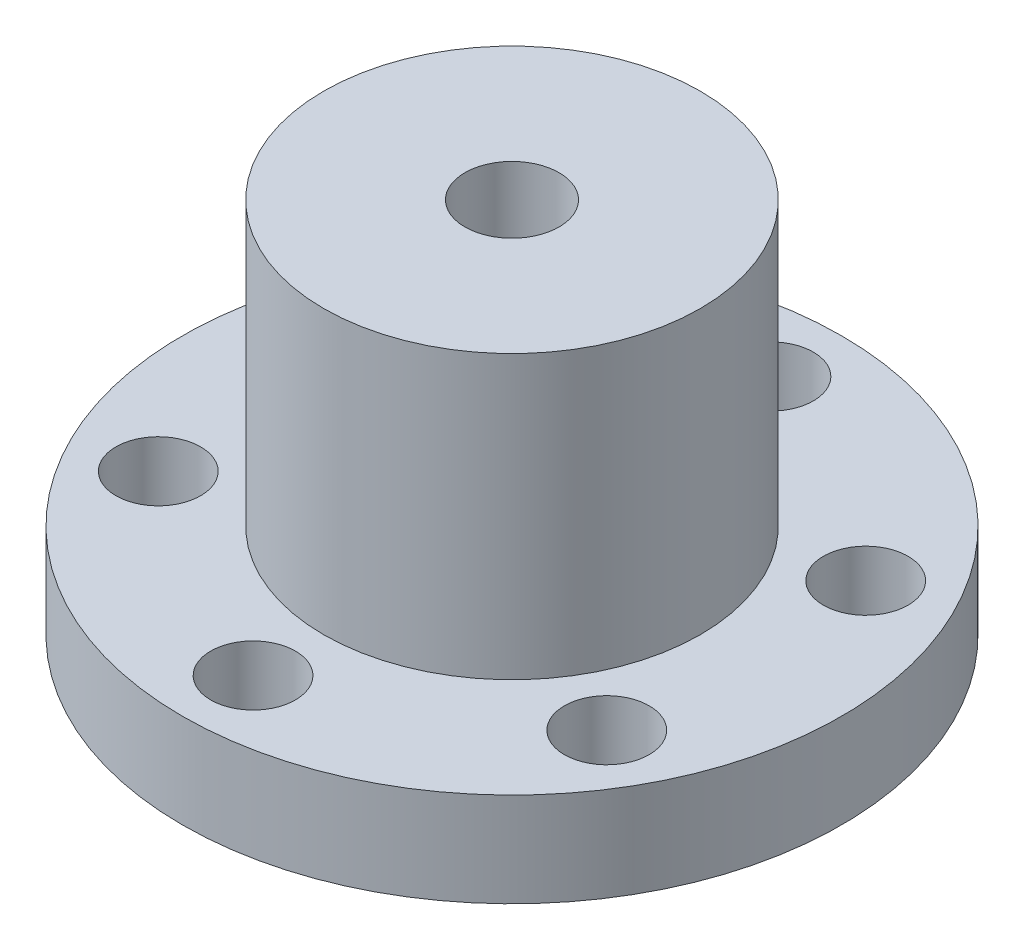
ISO-10303-21;
HEADER;
FILE_DESCRIPTION(('STEP AP214'),'2;1');
FILE_NAME('part.step','',(''),(''),'','','');
FILE_SCHEMA(('AUTOMOTIVE_DESIGN { 1 0 10303 214 1 1 1 1 }'));
ENDSEC;
DATA;
#1=APPLICATION_CONTEXT('core data for automotive mechanical design processes');
#2=APPLICATION_PROTOCOL_DEFINITION('international standard','automotive_design',2000,#1);
#3=PRODUCT_CONTEXT('',#1,'mechanical');
#4=PRODUCT('Part','Part','',(#3));
#5=PRODUCT_RELATED_PRODUCT_CATEGORY('part','',(#4));
#6=PRODUCT_DEFINITION_FORMATION('','',#4);
#7=PRODUCT_DEFINITION_CONTEXT('part definition',#1,'design');
#8=PRODUCT_DEFINITION('design','',#6,#7);
#9=PRODUCT_DEFINITION_SHAPE('','',#8);
#10=(LENGTH_UNIT() NAMED_UNIT(*) SI_UNIT(.MILLI.,.METRE.));
#11=(NAMED_UNIT(*) PLANE_ANGLE_UNIT() SI_UNIT($,.RADIAN.));
#12=(NAMED_UNIT(*) SI_UNIT($,.STERADIAN.) SOLID_ANGLE_UNIT());
#13=UNCERTAINTY_MEASURE_WITH_UNIT(LENGTH_MEASURE(1.E-05),#10,'distance_accuracy_value','');
#14=(GEOMETRIC_REPRESENTATION_CONTEXT(3) GLOBAL_UNCERTAINTY_ASSIGNED_CONTEXT((#13)) GLOBAL_UNIT_ASSIGNED_CONTEXT((#10,
#11,#12)) REPRESENTATION_CONTEXT('',''));
#15=CARTESIAN_POINT('',(0.,0.,0.));
#16=DIRECTION('',(0.,0.,1.));
#17=DIRECTION('',(1.,0.,0.));
#18=AXIS2_PLACEMENT_3D('',#15,#16,#17);
#19=CARTESIAN_POINT('',(0.,5.,0.));
#20=DIRECTION('',(0.,1.,0.));
#21=DIRECTION('',(0.,0.,1.));
#22=AXIS2_PLACEMENT_3D('',#19,#20,#21);
#23=PLANE('',#22);
#24=CARTESIAN_POINT('',(0.,5.,0.));
#25=DIRECTION('',(0.,1.,0.));
#26=DIRECTION('',(0.,0.,1.));
#27=AXIS2_PLACEMENT_3D('',#24,#25,#26);
#28=CIRCLE('',#27,10.);
#29=CARTESIAN_POINT('',(0.,5.,10.));
#30=VERTEX_POINT('',#29);
#31=EDGE_CURVE('E108',#30,#30,#28,.T.);
#32=ORIENTED_EDGE('',*,*,#31,.F.);
#33=EDGE_LOOP('',(#32));
#34=FACE_BOUND('',#33,.T.);
#35=CARTESIAN_POINT('',(-11.907849302036,5.,6.87500000000001));
#36=DIRECTION('',(0.,1.,0.));
#37=DIRECTION('',(0.,0.,1.));
#38=AXIS2_PLACEMENT_3D('',#35,#36,#37);
#39=CIRCLE('',#38,2.25);
#40=CARTESIAN_POINT('',(-11.907849302036,5.,9.12500000000001));
#41=VERTEX_POINT('',#40);
#42=EDGE_CURVE('E88',#41,#41,#39,.T.);
#43=ORIENTED_EDGE('',*,*,#42,.F.);
#44=EDGE_LOOP('',(#43));
#45=FACE_BOUND('',#44,.T.);
#46=CARTESIAN_POINT('',(11.907849302036,5.,6.875));
#47=DIRECTION('',(0.,1.,0.));
#48=DIRECTION('',(0.,0.,1.));
#49=AXIS2_PLACEMENT_3D('',#46,#47,#48);
#50=CIRCLE('',#49,2.25);
#51=CARTESIAN_POINT('',(11.907849302036,5.,9.125));
#52=VERTEX_POINT('',#51);
#53=EDGE_CURVE('E72',#52,#52,#50,.T.);
#54=ORIENTED_EDGE('',*,*,#53,.F.);
#55=EDGE_LOOP('',(#54));
#56=FACE_BOUND('',#55,.T.);
#57=CARTESIAN_POINT('',(0.,5.,-13.75));
#58=DIRECTION('',(0.,1.,0.));
#59=DIRECTION('',(0.,0.,1.));
#60=AXIS2_PLACEMENT_3D('',#57,#58,#59);
#61=CIRCLE('',#60,2.25);
#62=CARTESIAN_POINT('',(0.,5.,-11.5));
#63=VERTEX_POINT('',#62);
#64=EDGE_CURVE('E58',#63,#63,#61,.T.);
#65=ORIENTED_EDGE('',*,*,#64,.F.);
#66=EDGE_LOOP('',(#65));
#67=FACE_BOUND('',#66,.T.);
#68=CARTESIAN_POINT('',(0.,5.,0.));
#69=DIRECTION('',(0.,1.,0.));
#70=DIRECTION('',(0.,0.,1.));
#71=AXIS2_PLACEMENT_3D('',#68,#69,#70);
#72=CIRCLE('',#71,17.5);
#73=CARTESIAN_POINT('',(0.,5.,17.5));
#74=VERTEX_POINT('',#73);
#75=EDGE_CURVE('E10',#74,#74,#72,.T.);
#76=ORIENTED_EDGE('',*,*,#75,.T.);
#77=EDGE_LOOP('',(#76));
#78=FACE_BOUND('',#77,.T.);
#79=CARTESIAN_POINT('',(11.9078493020363,5.,-6.87499999999999));
#80=DIRECTION('',(0.,1.,0.));
#81=DIRECTION('',(0.,0.,1.));
#82=AXIS2_PLACEMENT_3D('',#79,#80,#81);
#83=CIRCLE('',#82,2.25);
#84=CARTESIAN_POINT('',(11.9078493020363,5.,-4.62499999999999));
#85=VERTEX_POINT('',#84);
#86=EDGE_CURVE('E64',#85,#85,#83,.T.);
#87=ORIENTED_EDGE('',*,*,#86,.F.);
#88=EDGE_LOOP('',(#87));
#89=FACE_BOUND('',#88,.T.);
#90=CARTESIAN_POINT('',(0.,5.,13.75));
#91=DIRECTION('',(0.,1.,0.));
#92=DIRECTION('',(0.,0.,1.));
#93=AXIS2_PLACEMENT_3D('',#90,#91,#92);
#94=CIRCLE('',#93,2.25);
#95=CARTESIAN_POINT('',(0.,5.,16.));
#96=VERTEX_POINT('',#95);
#97=EDGE_CURVE('E80',#96,#96,#94,.T.);
#98=ORIENTED_EDGE('',*,*,#97,.F.);
#99=EDGE_LOOP('',(#98));
#100=FACE_BOUND('',#99,.T.);
#101=CARTESIAN_POINT('',(-11.9078493020362,5.,-6.87499999999974));
#102=DIRECTION('',(0.,1.,0.));
#103=DIRECTION('',(0.,0.,1.));
#104=AXIS2_PLACEMENT_3D('',#101,#102,#103);
#105=CIRCLE('',#104,2.25);
#106=CARTESIAN_POINT('',(-11.9078493020362,5.,-4.62499999999974));
#107=VERTEX_POINT('',#106);
#108=EDGE_CURVE('E96',#107,#107,#105,.T.);
#109=ORIENTED_EDGE('',*,*,#108,.F.);
#110=EDGE_LOOP('',(#109));
#111=FACE_BOUND('',#110,.T.);
#112=ADVANCED_FACE('F45',(#34,#45,#56,#67,#78,#89,#100,#111),#23,.T.);
#113=CARTESIAN_POINT('',(0.,0.,0.));
#114=DIRECTION('',(0.,1.,0.));
#115=DIRECTION('',(0.,0.,1.));
#116=AXIS2_PLACEMENT_3D('',#113,#114,#115);
#117=PLANE('',#116);
#118=CARTESIAN_POINT('',(0.,0.,0.));
#119=DIRECTION('',(0.,1.,0.));
#120=DIRECTION('',(0.,0.,1.));
#121=AXIS2_PLACEMENT_3D('',#118,#119,#120);
#122=CIRCLE('',#121,2.5);
#123=CARTESIAN_POINT('',(0.,0.,2.5));
#124=VERTEX_POINT('',#123);
#125=EDGE_CURVE('E112',#124,#124,#122,.T.);
#126=ORIENTED_EDGE('',*,*,#125,.T.);
#127=EDGE_LOOP('',(#126));
#128=FACE_BOUND('',#127,.T.);
#129=CARTESIAN_POINT('',(0.,0.,0.));
#130=DIRECTION('',(0.,1.,0.));
#131=DIRECTION('',(0.,0.,1.));
#132=AXIS2_PLACEMENT_3D('',#129,#130,#131);
#133=CIRCLE('',#132,17.5);
#134=CARTESIAN_POINT('',(0.,0.,17.5));
#135=VERTEX_POINT('',#134);
#136=EDGE_CURVE('E49',#135,#135,#133,.T.);
#137=ORIENTED_EDGE('',*,*,#136,.F.);
#138=EDGE_LOOP('',(#137));
#139=FACE_BOUND('',#138,.T.);
#140=CARTESIAN_POINT('',(0.,0.,-13.75));
#141=DIRECTION('',(0.,1.,0.));
#142=DIRECTION('',(0.,0.,1.));
#143=AXIS2_PLACEMENT_3D('',#140,#141,#142);
#144=CIRCLE('',#143,2.25);
#145=CARTESIAN_POINT('',(0.,0.,-11.5));
#146=VERTEX_POINT('',#145);
#147=EDGE_CURVE('E60',#146,#146,#144,.T.);
#148=ORIENTED_EDGE('',*,*,#147,.T.);
#149=EDGE_LOOP('',(#148));
#150=FACE_BOUND('',#149,.T.);
#151=CARTESIAN_POINT('',(11.9078493020363,0.,-6.87499999999999));
#152=DIRECTION('',(0.,1.,0.));
#153=DIRECTION('',(0.,0.,1.));
#154=AXIS2_PLACEMENT_3D('',#151,#152,#153);
#155=CIRCLE('',#154,2.25);
#156=CARTESIAN_POINT('',(11.9078493020363,0.,-4.62499999999999));
#157=VERTEX_POINT('',#156);
#158=EDGE_CURVE('E68',#157,#157,#155,.T.);
#159=ORIENTED_EDGE('',*,*,#158,.T.);
#160=EDGE_LOOP('',(#159));
#161=FACE_BOUND('',#160,.T.);
#162=CARTESIAN_POINT('',(11.907849302036,0.,6.875));
#163=DIRECTION('',(0.,1.,0.));
#164=DIRECTION('',(0.,0.,1.));
#165=AXIS2_PLACEMENT_3D('',#162,#163,#164);
#166=CIRCLE('',#165,2.25);
#167=CARTESIAN_POINT('',(11.907849302036,0.,9.125));
#168=VERTEX_POINT('',#167);
#169=EDGE_CURVE('E76',#168,#168,#166,.T.);
#170=ORIENTED_EDGE('',*,*,#169,.T.);
#171=EDGE_LOOP('',(#170));
#172=FACE_BOUND('',#171,.T.);
#173=CARTESIAN_POINT('',(0.,0.,13.75));
#174=DIRECTION('',(0.,1.,0.));
#175=DIRECTION('',(0.,0.,1.));
#176=AXIS2_PLACEMENT_3D('',#173,#174,#175);
#177=CIRCLE('',#176,2.25);
#178=CARTESIAN_POINT('',(0.,0.,16.));
#179=VERTEX_POINT('',#178);
#180=EDGE_CURVE('E84',#179,#179,#177,.T.);
#181=ORIENTED_EDGE('',*,*,#180,.T.);
#182=EDGE_LOOP('',(#181));
#183=FACE_BOUND('',#182,.T.);
#184=CARTESIAN_POINT('',(-11.907849302036,0.,6.87500000000001));
#185=DIRECTION('',(0.,1.,0.));
#186=DIRECTION('',(0.,0.,1.));
#187=AXIS2_PLACEMENT_3D('',#184,#185,#186);
#188=CIRCLE('',#187,2.25);
#189=CARTESIAN_POINT('',(-11.907849302036,0.,9.12500000000001));
#190=VERTEX_POINT('',#189);
#191=EDGE_CURVE('E92',#190,#190,#188,.T.);
#192=ORIENTED_EDGE('',*,*,#191,.T.);
#193=EDGE_LOOP('',(#192));
#194=FACE_BOUND('',#193,.T.);
#195=CARTESIAN_POINT('',(-11.9078493020362,0.,-6.87499999999974));
#196=DIRECTION('',(0.,1.,0.));
#197=DIRECTION('',(0.,0.,1.));
#198=AXIS2_PLACEMENT_3D('',#195,#196,#197);
#199=CIRCLE('',#198,2.25);
#200=CARTESIAN_POINT('',(-11.9078493020362,0.,-4.62499999999974));
#201=VERTEX_POINT('',#200);
#202=EDGE_CURVE('E100',#201,#201,#199,.T.);
#203=ORIENTED_EDGE('',*,*,#202,.T.);
#204=EDGE_LOOP('',(#203));
#205=FACE_BOUND('',#204,.T.);
#206=ADVANCED_FACE('F124',(#128,#139,#150,#161,#172,#183,#194,#205),#117,.F.);
#207=CARTESIAN_POINT('',(0.,5.,0.));
#208=DIRECTION('',(0.,-1.,0.));
#209=DIRECTION('',(0.,0.,-1.));
#210=AXIS2_PLACEMENT_3D('',#207,#208,#209);
#211=CYLINDRICAL_SURFACE('',#210,17.5);
#212=ORIENTED_EDGE('',*,*,#75,.F.);
#213=EDGE_LOOP('',(#212));
#214=FACE_BOUND('',#213,.T.);
#215=ORIENTED_EDGE('',*,*,#136,.T.);
#216=EDGE_LOOP('',(#215));
#217=FACE_BOUND('',#216,.T.);
#218=ADVANCED_FACE('F47',(#214,#217),#211,.T.);
#219=CARTESIAN_POINT('',(0.,5.,-13.75));
#220=DIRECTION('',(0.,-1.,0.));
#221=DIRECTION('',(0.,0.,-1.));
#222=AXIS2_PLACEMENT_3D('',#219,#220,#221);
#223=CYLINDRICAL_SURFACE('',#222,2.25);
#224=ORIENTED_EDGE('',*,*,#64,.T.);
#225=EDGE_LOOP('',(#224));
#226=FACE_BOUND('',#225,.T.);
#227=ORIENTED_EDGE('',*,*,#147,.F.);
#228=EDGE_LOOP('',(#227));
#229=FACE_BOUND('',#228,.T.);
#230=ADVANCED_FACE('F171',(#226,#229),#223,.F.);
#231=CARTESIAN_POINT('',(11.9078493020363,5.,-6.87499999999999));
#232=DIRECTION('',(0.,-1.,0.));
#233=DIRECTION('',(0.,0.,-1.));
#234=AXIS2_PLACEMENT_3D('',#231,#232,#233);
#235=CYLINDRICAL_SURFACE('',#234,2.25);
#236=ORIENTED_EDGE('',*,*,#86,.T.);
#237=EDGE_LOOP('',(#236));
#238=FACE_BOUND('',#237,.T.);
#239=ORIENTED_EDGE('',*,*,#158,.F.);
#240=EDGE_LOOP('',(#239));
#241=FACE_BOUND('',#240,.T.);
#242=ADVANCED_FACE('F176',(#238,#241),#235,.F.);
#243=CARTESIAN_POINT('',(11.907849302036,5.,6.875));
#244=DIRECTION('',(0.,-1.,0.));
#245=DIRECTION('',(0.,0.,-1.));
#246=AXIS2_PLACEMENT_3D('',#243,#244,#245);
#247=CYLINDRICAL_SURFACE('',#246,2.25);
#248=ORIENTED_EDGE('',*,*,#53,.T.);
#249=EDGE_LOOP('',(#248));
#250=FACE_BOUND('',#249,.T.);
#251=ORIENTED_EDGE('',*,*,#169,.F.);
#252=EDGE_LOOP('',(#251));
#253=FACE_BOUND('',#252,.T.);
#254=ADVANCED_FACE('F180',(#250,#253),#247,.F.);
#255=CARTESIAN_POINT('',(0.,5.,13.75));
#256=DIRECTION('',(0.,-1.,0.));
#257=DIRECTION('',(0.,0.,-1.));
#258=AXIS2_PLACEMENT_3D('',#255,#256,#257);
#259=CYLINDRICAL_SURFACE('',#258,2.25);
#260=ORIENTED_EDGE('',*,*,#97,.T.);
#261=EDGE_LOOP('',(#260));
#262=FACE_BOUND('',#261,.T.);
#263=ORIENTED_EDGE('',*,*,#180,.F.);
#264=EDGE_LOOP('',(#263));
#265=FACE_BOUND('',#264,.T.);
#266=ADVANCED_FACE('F184',(#262,#265),#259,.F.);
#267=CARTESIAN_POINT('',(-11.907849302036,5.,6.87500000000001));
#268=DIRECTION('',(0.,-1.,0.));
#269=DIRECTION('',(0.,0.,-1.));
#270=AXIS2_PLACEMENT_3D('',#267,#268,#269);
#271=CYLINDRICAL_SURFACE('',#270,2.25);
#272=ORIENTED_EDGE('',*,*,#42,.T.);
#273=EDGE_LOOP('',(#272));
#274=FACE_BOUND('',#273,.T.);
#275=ORIENTED_EDGE('',*,*,#191,.F.);
#276=EDGE_LOOP('',(#275));
#277=FACE_BOUND('',#276,.T.);
#278=ADVANCED_FACE('F163',(#274,#277),#271,.F.);
#279=CARTESIAN_POINT('',(-11.9078493020362,5.,-6.87499999999974));
#280=DIRECTION('',(0.,-1.,0.));
#281=DIRECTION('',(0.,0.,-1.));
#282=AXIS2_PLACEMENT_3D('',#279,#280,#281);
#283=CYLINDRICAL_SURFACE('',#282,2.25);
#284=ORIENTED_EDGE('',*,*,#108,.T.);
#285=EDGE_LOOP('',(#284));
#286=FACE_BOUND('',#285,.T.);
#287=ORIENTED_EDGE('',*,*,#202,.F.);
#288=EDGE_LOOP('',(#287));
#289=FACE_BOUND('',#288,.T.);
#290=ADVANCED_FACE('F142',(#286,#289),#283,.F.);
#291=CARTESIAN_POINT('',(0.,20.,0.));
#292=DIRECTION('',(0.,-1.,0.));
#293=DIRECTION('',(0.,0.,-1.));
#294=AXIS2_PLACEMENT_3D('',#291,#292,#293);
#295=CYLINDRICAL_SURFACE('',#294,10.);
#296=CARTESIAN_POINT('',(0.,20.,0.));
#297=DIRECTION('',(0.,1.,0.));
#298=DIRECTION('',(0.,0.,1.));
#299=AXIS2_PLACEMENT_3D('',#296,#297,#298);
#300=CIRCLE('',#299,10.);
#301=CARTESIAN_POINT('',(0.,20.,10.));
#302=VERTEX_POINT('',#301);
#303=EDGE_CURVE('E104',#302,#302,#300,.T.);
#304=ORIENTED_EDGE('',*,*,#303,.F.);
#305=EDGE_LOOP('',(#304));
#306=FACE_BOUND('',#305,.T.);
#307=ORIENTED_EDGE('',*,*,#31,.T.);
#308=EDGE_LOOP('',(#307));
#309=FACE_BOUND('',#308,.T.);
#310=ADVANCED_FACE('F136',(#306,#309),#295,.T.);
#311=CARTESIAN_POINT('',(0.,20.,0.));
#312=DIRECTION('',(0.,1.,0.));
#313=DIRECTION('',(0.,0.,1.));
#314=AXIS2_PLACEMENT_3D('',#311,#312,#313);
#315=PLANE('',#314);
#316=CARTESIAN_POINT('',(0.,20.,0.));
#317=DIRECTION('',(0.,1.,0.));
#318=DIRECTION('',(0.,0.,1.));
#319=AXIS2_PLACEMENT_3D('',#316,#317,#318);
#320=CIRCLE('',#319,2.5);
#321=CARTESIAN_POINT('',(0.,20.,2.5));
#322=VERTEX_POINT('',#321);
#323=EDGE_CURVE('E116',#322,#322,#320,.T.);
#324=ORIENTED_EDGE('',*,*,#323,.F.);
#325=EDGE_LOOP('',(#324));
#326=FACE_BOUND('',#325,.T.);
#327=ORIENTED_EDGE('',*,*,#303,.T.);
#328=EDGE_LOOP('',(#327));
#329=FACE_BOUND('',#328,.T.);
#330=ADVANCED_FACE('F130',(#326,#329),#315,.T.);
#331=CARTESIAN_POINT('',(0.,0.,0.));
#332=DIRECTION('',(0.,1.,0.));
#333=DIRECTION('',(0.,0.,1.));
#334=AXIS2_PLACEMENT_3D('',#331,#332,#333);
#335=CYLINDRICAL_SURFACE('',#334,2.5);
#336=ORIENTED_EDGE('',*,*,#125,.F.);
#337=EDGE_LOOP('',(#336));
#338=FACE_BOUND('',#337,.T.);
#339=ORIENTED_EDGE('',*,*,#323,.T.);
#340=EDGE_LOOP('',(#339));
#341=FACE_BOUND('',#340,.T.);
#342=ADVANCED_FACE('F127',(#338,#341),#335,.F.);
#343=CLOSED_SHELL('',(#112,#206,#218,#230,#242,#254,#266,#278,#290,#310,#330,#342));
#344=MANIFOLD_SOLID_BREP('B2',#343);
#345=ADVANCED_BREP_SHAPE_REPRESENTATION('',(#18,#344),#14);
#346=SHAPE_DEFINITION_REPRESENTATION(#9,#345);
ENDSEC;
END-ISO-10303-21;
